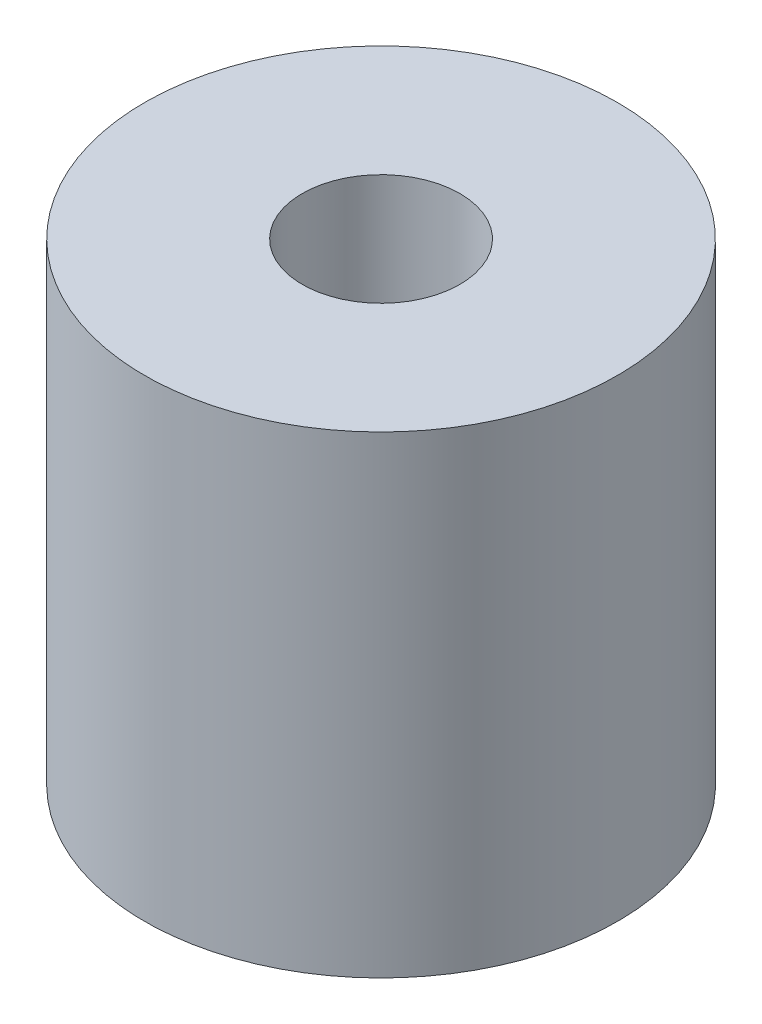
ISO-10303-21;
HEADER;
FILE_DESCRIPTION(('STEP AP214'),'2;1');
FILE_NAME('part.step','',(''),(''),'','','');
FILE_SCHEMA(('AUTOMOTIVE_DESIGN { 1 0 10303 214 1 1 1 1 }'));
ENDSEC;
DATA;
#1=APPLICATION_CONTEXT('core data for automotive mechanical design processes');
#2=APPLICATION_PROTOCOL_DEFINITION('international standard','automotive_design',2000,#1);
#3=PRODUCT_CONTEXT('',#1,'mechanical');
#4=PRODUCT('Part','Part','',(#3));
#5=PRODUCT_RELATED_PRODUCT_CATEGORY('part','',(#4));
#6=PRODUCT_DEFINITION_FORMATION('','',#4);
#7=PRODUCT_DEFINITION_CONTEXT('part definition',#1,'design');
#8=PRODUCT_DEFINITION('design','',#6,#7);
#9=PRODUCT_DEFINITION_SHAPE('','',#8);
#10=(LENGTH_UNIT() NAMED_UNIT(*) SI_UNIT(.MILLI.,.METRE.));
#11=(NAMED_UNIT(*) PLANE_ANGLE_UNIT() SI_UNIT($,.RADIAN.));
#12=(NAMED_UNIT(*) SI_UNIT($,.STERADIAN.) SOLID_ANGLE_UNIT());
#13=UNCERTAINTY_MEASURE_WITH_UNIT(LENGTH_MEASURE(1.E-05),#10,'distance_accuracy_value','');
#14=(GEOMETRIC_REPRESENTATION_CONTEXT(3) GLOBAL_UNCERTAINTY_ASSIGNED_CONTEXT((#13)) GLOBAL_UNIT_ASSIGNED_CONTEXT((#10,
#11,#12)) REPRESENTATION_CONTEXT('',''));
#15=CARTESIAN_POINT('',(0.,0.,0.));
#16=DIRECTION('',(0.,0.,1.));
#17=DIRECTION('',(1.,0.,0.));
#18=AXIS2_PLACEMENT_3D('',#15,#16,#17);
#19=CARTESIAN_POINT('',(0.,-40.,0.));
#20=DIRECTION('',(0.,-1.,0.));
#21=DIRECTION('',(0.,0.,-1.));
#22=AXIS2_PLACEMENT_3D('',#19,#20,#21);
#23=CYLINDRICAL_SURFACE('',#22,10.);
#24=CARTESIAN_POINT('',(0.,-30.,0.));
#25=DIRECTION('',(0.,-1.,0.));
#26=DIRECTION('',(0.,0.,-1.));
#27=AXIS2_PLACEMENT_3D('',#24,#25,#26);
#28=CIRCLE('',#27,10.);
#29=CARTESIAN_POINT('',(0.,-30.,-10.));
#30=VERTEX_POINT('',#29);
#31=EDGE_CURVE('E10',#30,#30,#28,.T.);
#32=ORIENTED_EDGE('',*,*,#31,.T.);
#33=EDGE_LOOP('',(#32));
#34=FACE_BOUND('',#33,.T.);
#35=CARTESIAN_POINT('',(0.,30.,0.));
#36=DIRECTION('',(0.,-1.,0.));
#37=DIRECTION('',(0.,0.,-1.));
#38=AXIS2_PLACEMENT_3D('',#35,#36,#37);
#39=CIRCLE('',#38,10.);
#40=CARTESIAN_POINT('',(0.,30.,-10.));
#41=VERTEX_POINT('',#40);
#42=EDGE_CURVE('E53',#41,#41,#39,.T.);
#43=ORIENTED_EDGE('',*,*,#42,.F.);
#44=EDGE_LOOP('',(#43));
#45=FACE_BOUND('',#44,.T.);
#46=ADVANCED_FACE('F39',(#34,#45),#23,.F.);
#47=CARTESIAN_POINT('',(10.,-30.,0.));
#48=DIRECTION('',(0.,-1.,0.));
#49=DIRECTION('',(0.,0.,-1.));
#50=AXIS2_PLACEMENT_3D('',#47,#48,#49);
#51=PLANE('',#50);
#52=CARTESIAN_POINT('',(0.,-30.,0.));
#53=DIRECTION('',(0.,-1.,0.));
#54=DIRECTION('',(0.,0.,-1.));
#55=AXIS2_PLACEMENT_3D('',#52,#53,#54);
#56=CIRCLE('',#55,30.);
#57=CARTESIAN_POINT('',(0.,-30.,-30.));
#58=VERTEX_POINT('',#57);
#59=EDGE_CURVE('E45',#58,#58,#56,.T.);
#60=ORIENTED_EDGE('',*,*,#59,.T.);
#61=EDGE_LOOP('',(#60));
#62=FACE_BOUND('',#61,.T.);
#63=ORIENTED_EDGE('',*,*,#31,.F.);
#64=EDGE_LOOP('',(#63));
#65=FACE_BOUND('',#64,.T.);
#66=ADVANCED_FACE('F63',(#62,#65),#51,.T.);
#67=CARTESIAN_POINT('',(0.,-40.,0.));
#68=DIRECTION('',(0.,-1.,0.));
#69=DIRECTION('',(0.,0.,-1.));
#70=AXIS2_PLACEMENT_3D('',#67,#68,#69);
#71=CYLINDRICAL_SURFACE('',#70,30.);
#72=CARTESIAN_POINT('',(0.,30.,0.));
#73=DIRECTION('',(0.,-1.,0.));
#74=DIRECTION('',(0.,0.,-1.));
#75=AXIS2_PLACEMENT_3D('',#72,#73,#74);
#76=CIRCLE('',#75,30.);
#77=CARTESIAN_POINT('',(0.,30.,-30.));
#78=VERTEX_POINT('',#77);
#79=EDGE_CURVE('E49',#78,#78,#76,.T.);
#80=ORIENTED_EDGE('',*,*,#79,.T.);
#81=EDGE_LOOP('',(#80));
#82=FACE_BOUND('',#81,.T.);
#83=ORIENTED_EDGE('',*,*,#59,.F.);
#84=EDGE_LOOP('',(#83));
#85=FACE_BOUND('',#84,.T.);
#86=ADVANCED_FACE('F67',(#82,#85),#71,.T.);
#87=CARTESIAN_POINT('',(30.,30.,0.));
#88=DIRECTION('',(0.,1.,0.));
#89=DIRECTION('',(0.,0.,1.));
#90=AXIS2_PLACEMENT_3D('',#87,#88,#89);
#91=PLANE('',#90);
#92=ORIENTED_EDGE('',*,*,#42,.T.);
#93=EDGE_LOOP('',(#92));
#94=FACE_BOUND('',#93,.T.);
#95=ORIENTED_EDGE('',*,*,#79,.F.);
#96=EDGE_LOOP('',(#95));
#97=FACE_BOUND('',#96,.T.);
#98=ADVANCED_FACE('F59',(#94,#97),#91,.T.);
#99=CLOSED_SHELL('',(#46,#66,#86,#98));
#100=MANIFOLD_SOLID_BREP('B2',#99);
#101=ADVANCED_BREP_SHAPE_REPRESENTATION('',(#18,#100),#14);
#102=SHAPE_DEFINITION_REPRESENTATION(#9,#101);
ENDSEC;
END-ISO-10303-21;
